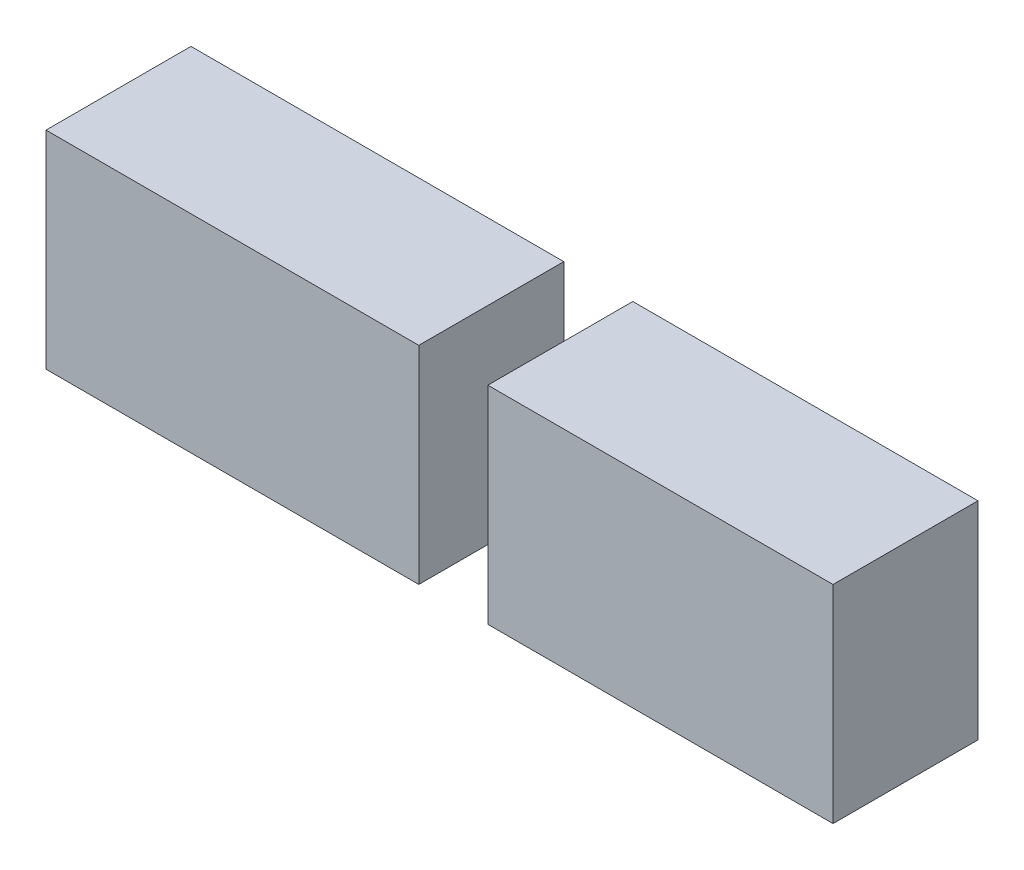
ISO-10303-21;
HEADER;
FILE_DESCRIPTION(('STEP AP214'),'2;1');
FILE_NAME('part.step','',(''),(''),'','','');
FILE_SCHEMA(('AUTOMOTIVE_DESIGN { 1 0 10303 214 1 1 1 1 }'));
ENDSEC;
DATA;
#1=APPLICATION_CONTEXT('core data for automotive mechanical design processes');
#2=APPLICATION_PROTOCOL_DEFINITION('international standard','automotive_design',2000,#1);
#3=PRODUCT_CONTEXT('',#1,'mechanical');
#4=PRODUCT('Part','Part','',(#3));
#5=PRODUCT_RELATED_PRODUCT_CATEGORY('part','',(#4));
#6=PRODUCT_DEFINITION_FORMATION('','',#4);
#7=PRODUCT_DEFINITION_CONTEXT('part definition',#1,'design');
#8=PRODUCT_DEFINITION('design','',#6,#7);
#9=PRODUCT_DEFINITION_SHAPE('','',#8);
#10=(LENGTH_UNIT() NAMED_UNIT(*) SI_UNIT(.MILLI.,.METRE.));
#11=(NAMED_UNIT(*) PLANE_ANGLE_UNIT() SI_UNIT($,.RADIAN.));
#12=(NAMED_UNIT(*) SI_UNIT($,.STERADIAN.) SOLID_ANGLE_UNIT());
#13=UNCERTAINTY_MEASURE_WITH_UNIT(LENGTH_MEASURE(1.E-05),#10,'distance_accuracy_value','');
#14=(GEOMETRIC_REPRESENTATION_CONTEXT(3) GLOBAL_UNCERTAINTY_ASSIGNED_CONTEXT((#13)) GLOBAL_UNIT_ASSIGNED_CONTEXT((#10,
#11,#12)) REPRESENTATION_CONTEXT('',''));
#15=CARTESIAN_POINT('',(0.,0.,0.));
#16=DIRECTION('',(0.,0.,1.));
#17=DIRECTION('',(1.,0.,0.));
#18=AXIS2_PLACEMENT_3D('',#15,#16,#17);
#19=CARTESIAN_POINT('',(-64.,30.,21.));
#20=DIRECTION('',(0.,0.,-1.));
#21=DIRECTION('',(0.,1.,0.));
#22=AXIS2_PLACEMENT_3D('',#19,#20,#21);
#23=PLANE('',#22);
#24=DIRECTION('',(0.,1.,0.));
#25=VECTOR('',#24,1.);
#26=CARTESIAN_POINT('',(-9.99999999999999,30.,21.));
#27=LINE('',#26,#25);
#28=CARTESIAN_POINT('',(-10.,0.,21.));
#29=VERTEX_POINT('',#28);
#30=CARTESIAN_POINT('',(-9.99999999999999,30.,21.));
#31=VERTEX_POINT('',#30);
#32=EDGE_CURVE('E109',#29,#31,#27,.T.);
#33=ORIENTED_EDGE('',*,*,#32,.T.);
#34=DIRECTION('',(1.,0.,0.));
#35=VECTOR('',#34,1.);
#36=CARTESIAN_POINT('',(-64.,30.,21.));
#37=LINE('',#36,#35);
#38=CARTESIAN_POINT('',(-64.,30.,21.));
#39=VERTEX_POINT('',#38);
#40=EDGE_CURVE('E12',#39,#31,#37,.T.);
#41=ORIENTED_EDGE('',*,*,#40,.F.);
#42=DIRECTION('',(0.,1.,0.));
#43=VECTOR('',#42,1.);
#44=CARTESIAN_POINT('',(-64.,30.,21.));
#45=LINE('',#44,#43);
#46=CARTESIAN_POINT('',(-64.,0.,21.));
#47=VERTEX_POINT('',#46);
#48=EDGE_CURVE('E97',#47,#39,#45,.T.);
#49=ORIENTED_EDGE('',*,*,#48,.F.);
#50=DIRECTION('',(1.,0.,0.));
#51=VECTOR('',#50,1.);
#52=CARTESIAN_POINT('',(-64.,0.,21.));
#53=LINE('',#52,#51);
#54=EDGE_CURVE('E105',#47,#29,#53,.T.);
#55=ORIENTED_EDGE('',*,*,#54,.T.);
#56=EDGE_LOOP('',(#33,#41,#49,#55));
#57=FACE_BOUND('',#56,.T.);
#58=ADVANCED_FACE('F46',(#57),#23,.F.);
#59=CARTESIAN_POINT('',(-64.,30.,21.));
#60=DIRECTION('',(0.,-1.,0.));
#61=DIRECTION('',(1.,0.,0.));
#62=AXIS2_PLACEMENT_3D('',#59,#60,#61);
#63=PLANE('',#62);
#64=DIRECTION('',(0.,0.,-1.));
#65=VECTOR('',#64,1.);
#66=CARTESIAN_POINT('',(-9.99999999999999,30.,21.));
#67=LINE('',#66,#65);
#68=CARTESIAN_POINT('',(-9.99999999999999,30.,0.));
#69=VERTEX_POINT('',#68);
#70=EDGE_CURVE('E101',#31,#69,#67,.T.);
#71=ORIENTED_EDGE('',*,*,#70,.T.);
#72=DIRECTION('',(1.,0.,0.));
#73=VECTOR('',#72,1.);
#74=CARTESIAN_POINT('',(-64.,30.,0.));
#75=LINE('',#74,#73);
#76=CARTESIAN_POINT('',(-64.,30.,0.));
#77=VERTEX_POINT('',#76);
#78=EDGE_CURVE('E54',#77,#69,#75,.T.);
#79=ORIENTED_EDGE('',*,*,#78,.F.);
#80=DIRECTION('',(0.,0.,-1.));
#81=VECTOR('',#80,1.);
#82=CARTESIAN_POINT('',(-64.,30.,21.));
#83=LINE('',#82,#81);
#84=EDGE_CURVE('E92',#39,#77,#83,.T.);
#85=ORIENTED_EDGE('',*,*,#84,.F.);
#86=ORIENTED_EDGE('',*,*,#40,.T.);
#87=EDGE_LOOP('',(#71,#79,#85,#86));
#88=FACE_BOUND('',#87,.T.);
#89=ADVANCED_FACE('F100',(#88),#63,.F.);
#90=CARTESIAN_POINT('',(-64.,30.,0.));
#91=DIRECTION('',(0.,0.,1.));
#92=DIRECTION('',(0.,-1.,0.));
#93=AXIS2_PLACEMENT_3D('',#90,#91,#92);
#94=PLANE('',#93);
#95=DIRECTION('',(0.,-1.,0.));
#96=VECTOR('',#95,1.);
#97=CARTESIAN_POINT('',(-9.99999999999999,30.,0.));
#98=LINE('',#97,#96);
#99=CARTESIAN_POINT('',(-10.,0.,0.));
#100=VERTEX_POINT('',#99);
#101=EDGE_CURVE('E79',#69,#100,#98,.T.);
#102=ORIENTED_EDGE('',*,*,#101,.T.);
#103=DIRECTION('',(1.,0.,0.));
#104=VECTOR('',#103,1.);
#105=CARTESIAN_POINT('',(-64.,0.,0.));
#106=LINE('',#105,#104);
#107=CARTESIAN_POINT('',(-64.,0.,0.));
#108=VERTEX_POINT('',#107);
#109=EDGE_CURVE('E102',#108,#100,#106,.T.);
#110=ORIENTED_EDGE('',*,*,#109,.F.);
#111=DIRECTION('',(0.,-1.,0.));
#112=VECTOR('',#111,1.);
#113=CARTESIAN_POINT('',(-64.,30.,0.));
#114=LINE('',#113,#112);
#115=EDGE_CURVE('E95',#77,#108,#114,.T.);
#116=ORIENTED_EDGE('',*,*,#115,.F.);
#117=ORIENTED_EDGE('',*,*,#78,.T.);
#118=EDGE_LOOP('',(#102,#110,#116,#117));
#119=FACE_BOUND('',#118,.T.);
#120=ADVANCED_FACE('F103',(#119),#94,.F.);
#121=CARTESIAN_POINT('',(-64.,0.,21.));
#122=DIRECTION('',(0.,1.,0.));
#123=DIRECTION('',(-1.,0.,0.));
#124=AXIS2_PLACEMENT_3D('',#121,#122,#123);
#125=PLANE('',#124);
#126=DIRECTION('',(0.,0.,1.));
#127=VECTOR('',#126,1.);
#128=CARTESIAN_POINT('',(-10.,0.,21.));
#129=LINE('',#128,#127);
#130=EDGE_CURVE('E85',#100,#29,#129,.T.);
#131=ORIENTED_EDGE('',*,*,#130,.T.);
#132=ORIENTED_EDGE('',*,*,#54,.F.);
#133=DIRECTION('',(0.,0.,1.));
#134=VECTOR('',#133,1.);
#135=CARTESIAN_POINT('',(-64.,0.,21.));
#136=LINE('',#135,#134);
#137=EDGE_CURVE('E62',#108,#47,#136,.T.);
#138=ORIENTED_EDGE('',*,*,#137,.F.);
#139=ORIENTED_EDGE('',*,*,#109,.T.);
#140=EDGE_LOOP('',(#131,#132,#138,#139));
#141=FACE_BOUND('',#140,.T.);
#142=ADVANCED_FACE('F116',(#141),#125,.F.);
#143=CARTESIAN_POINT('',(-64.,0.,0.));
#144=DIRECTION('',(1.,0.,0.));
#145=DIRECTION('',(0.,1.,0.));
#146=AXIS2_PLACEMENT_3D('',#143,#144,#145);
#147=PLANE('',#146);
#148=ORIENTED_EDGE('',*,*,#48,.T.);
#149=ORIENTED_EDGE('',*,*,#84,.T.);
#150=ORIENTED_EDGE('',*,*,#115,.T.);
#151=ORIENTED_EDGE('',*,*,#137,.T.);
#152=EDGE_LOOP('',(#148,#149,#150,#151));
#153=FACE_BOUND('',#152,.T.);
#154=ADVANCED_FACE('F93',(#153),#147,.F.);
#155=CARTESIAN_POINT('',(-10.,0.,0.));
#156=DIRECTION('',(1.,0.,0.));
#157=DIRECTION('',(0.,1.,0.));
#158=AXIS2_PLACEMENT_3D('',#155,#156,#157);
#159=PLANE('',#158);
#160=ORIENTED_EDGE('',*,*,#32,.F.);
#161=ORIENTED_EDGE('',*,*,#130,.F.);
#162=ORIENTED_EDGE('',*,*,#101,.F.);
#163=ORIENTED_EDGE('',*,*,#70,.F.);
#164=EDGE_LOOP('',(#160,#161,#162,#163));
#165=FACE_BOUND('',#164,.T.);
#166=ADVANCED_FACE('F119',(#165),#159,.T.);
#167=CLOSED_SHELL('',(#58,#89,#120,#142,#154,#166));
#168=MANIFOLD_SOLID_BREP('B2',#167);
#169=CARTESIAN_POINT('',(0.,0.,21.));
#170=DIRECTION('',(1.,0.,0.));
#171=DIRECTION('',(0.,1.,0.));
#172=AXIS2_PLACEMENT_3D('',#169,#170,#171);
#173=PLANE('',#172);
#174=DIRECTION('',(0.,-1.,0.));
#175=VECTOR('',#174,1.);
#176=CARTESIAN_POINT('',(0.,0.,0.));
#177=LINE('',#176,#175);
#178=CARTESIAN_POINT('',(0.,30.,0.));
#179=VERTEX_POINT('',#178);
#180=CARTESIAN_POINT('',(0.,0.,0.));
#181=VERTEX_POINT('',#180);
#182=EDGE_CURVE('E232',#179,#181,#177,.T.);
#183=ORIENTED_EDGE('',*,*,#182,.T.);
#184=DIRECTION('',(0.,0.,-1.));
#185=VECTOR('',#184,1.);
#186=CARTESIAN_POINT('',(0.,0.,21.));
#187=LINE('',#186,#185);
#188=CARTESIAN_POINT('',(0.,0.,21.));
#189=VERTEX_POINT('',#188);
#190=EDGE_CURVE('E44',#189,#181,#187,.T.);
#191=ORIENTED_EDGE('',*,*,#190,.F.);
#192=DIRECTION('',(0.,-1.,0.));
#193=VECTOR('',#192,1.);
#194=CARTESIAN_POINT('',(0.,0.,21.));
#195=LINE('',#194,#193);
#196=CARTESIAN_POINT('',(0.,30.,21.));
#197=VERTEX_POINT('',#196);
#198=EDGE_CURVE('E220',#197,#189,#195,.T.);
#199=ORIENTED_EDGE('',*,*,#198,.F.);
#200=DIRECTION('',(0.,0.,-1.));
#201=VECTOR('',#200,1.);
#202=CARTESIAN_POINT('',(0.,30.,21.));
#203=LINE('',#202,#201);
#204=EDGE_CURVE('E228',#197,#179,#203,.T.);
#205=ORIENTED_EDGE('',*,*,#204,.T.);
#206=EDGE_LOOP('',(#183,#191,#199,#205));
#207=FACE_BOUND('',#206,.T.);
#208=ADVANCED_FACE('F169',(#207),#173,.F.);
#209=CARTESIAN_POINT('',(0.,0.,21.));
#210=DIRECTION('',(0.,1.,0.));
#211=DIRECTION('',(0.,0.,1.));
#212=AXIS2_PLACEMENT_3D('',#209,#210,#211);
#213=PLANE('',#212);
#214=DIRECTION('',(1.,0.,0.));
#215=VECTOR('',#214,1.);
#216=CARTESIAN_POINT('',(0.,0.,0.));
#217=LINE('',#216,#215);
#218=CARTESIAN_POINT('',(50.,0.,0.));
#219=VERTEX_POINT('',#218);
#220=EDGE_CURVE('E224',#181,#219,#217,.T.);
#221=ORIENTED_EDGE('',*,*,#220,.T.);
#222=DIRECTION('',(0.,0.,-1.));
#223=VECTOR('',#222,1.);
#224=CARTESIAN_POINT('',(50.,0.,21.));
#225=LINE('',#224,#223);
#226=CARTESIAN_POINT('',(50.,0.,21.));
#227=VERTEX_POINT('',#226);
#228=EDGE_CURVE('E177',#227,#219,#225,.T.);
#229=ORIENTED_EDGE('',*,*,#228,.F.);
#230=DIRECTION('',(1.,0.,0.));
#231=VECTOR('',#230,1.);
#232=CARTESIAN_POINT('',(0.,0.,21.));
#233=LINE('',#232,#231);
#234=EDGE_CURVE('E215',#189,#227,#233,.T.);
#235=ORIENTED_EDGE('',*,*,#234,.F.);
#236=ORIENTED_EDGE('',*,*,#190,.T.);
#237=EDGE_LOOP('',(#221,#229,#235,#236));
#238=FACE_BOUND('',#237,.T.);
#239=ADVANCED_FACE('F223',(#238),#213,.F.);
#240=CARTESIAN_POINT('',(50.,0.,21.));
#241=DIRECTION('',(-1.,0.,0.));
#242=DIRECTION('',(0.,0.,1.));
#243=AXIS2_PLACEMENT_3D('',#240,#241,#242);
#244=PLANE('',#243);
#245=DIRECTION('',(0.,1.,0.));
#246=VECTOR('',#245,1.);
#247=CARTESIAN_POINT('',(50.,0.,0.));
#248=LINE('',#247,#246);
#249=CARTESIAN_POINT('',(50.,30.,0.));
#250=VERTEX_POINT('',#249);
#251=EDGE_CURVE('E202',#219,#250,#248,.T.);
#252=ORIENTED_EDGE('',*,*,#251,.T.);
#253=DIRECTION('',(0.,0.,-1.));
#254=VECTOR('',#253,1.);
#255=CARTESIAN_POINT('',(50.,30.,21.));
#256=LINE('',#255,#254);
#257=CARTESIAN_POINT('',(50.,30.,21.));
#258=VERTEX_POINT('',#257);
#259=EDGE_CURVE('E225',#258,#250,#256,.T.);
#260=ORIENTED_EDGE('',*,*,#259,.F.);
#261=DIRECTION('',(0.,1.,0.));
#262=VECTOR('',#261,1.);
#263=CARTESIAN_POINT('',(50.,0.,21.));
#264=LINE('',#263,#262);
#265=EDGE_CURVE('E218',#227,#258,#264,.T.);
#266=ORIENTED_EDGE('',*,*,#265,.F.);
#267=ORIENTED_EDGE('',*,*,#228,.T.);
#268=EDGE_LOOP('',(#252,#260,#266,#267));
#269=FACE_BOUND('',#268,.T.);
#270=ADVANCED_FACE('F226',(#269),#244,.F.);
#271=CARTESIAN_POINT('',(0.,30.,21.));
#272=DIRECTION('',(0.,-1.,0.));
#273=DIRECTION('',(0.,0.,-1.));
#274=AXIS2_PLACEMENT_3D('',#271,#272,#273);
#275=PLANE('',#274);
#276=DIRECTION('',(-1.,0.,0.));
#277=VECTOR('',#276,1.);
#278=CARTESIAN_POINT('',(0.,30.,0.));
#279=LINE('',#278,#277);
#280=EDGE_CURVE('E208',#250,#179,#279,.T.);
#281=ORIENTED_EDGE('',*,*,#280,.T.);
#282=ORIENTED_EDGE('',*,*,#204,.F.);
#283=DIRECTION('',(-1.,0.,0.));
#284=VECTOR('',#283,1.);
#285=CARTESIAN_POINT('',(0.,30.,21.));
#286=LINE('',#285,#284);
#287=EDGE_CURVE('E185',#258,#197,#286,.T.);
#288=ORIENTED_EDGE('',*,*,#287,.F.);
#289=ORIENTED_EDGE('',*,*,#259,.T.);
#290=EDGE_LOOP('',(#281,#282,#288,#289));
#291=FACE_BOUND('',#290,.T.);
#292=ADVANCED_FACE('F239',(#291),#275,.F.);
#293=CARTESIAN_POINT('',(0.,0.,21.));
#294=DIRECTION('',(0.,0.,-1.));
#295=DIRECTION('',(-1.,0.,0.));
#296=AXIS2_PLACEMENT_3D('',#293,#294,#295);
#297=PLANE('',#296);
#298=ORIENTED_EDGE('',*,*,#198,.T.);
#299=ORIENTED_EDGE('',*,*,#234,.T.);
#300=ORIENTED_EDGE('',*,*,#265,.T.);
#301=ORIENTED_EDGE('',*,*,#287,.T.);
#302=EDGE_LOOP('',(#298,#299,#300,#301));
#303=FACE_BOUND('',#302,.T.);
#304=ADVANCED_FACE('F216',(#303),#297,.F.);
#305=CARTESIAN_POINT('',(0.,0.,0.));
#306=DIRECTION('',(0.,0.,-1.));
#307=DIRECTION('',(-1.,0.,0.));
#308=AXIS2_PLACEMENT_3D('',#305,#306,#307);
#309=PLANE('',#308);
#310=ORIENTED_EDGE('',*,*,#182,.F.);
#311=ORIENTED_EDGE('',*,*,#280,.F.);
#312=ORIENTED_EDGE('',*,*,#251,.F.);
#313=ORIENTED_EDGE('',*,*,#220,.F.);
#314=EDGE_LOOP('',(#310,#311,#312,#313));
#315=FACE_BOUND('',#314,.T.);
#316=ADVANCED_FACE('F242',(#315),#309,.T.);
#317=CLOSED_SHELL('',(#208,#239,#270,#292,#304,#316));
#318=MANIFOLD_SOLID_BREP('B6',#317);
#319=ADVANCED_BREP_SHAPE_REPRESENTATION('',(#18,#168,#318),#14);
#320=SHAPE_DEFINITION_REPRESENTATION(#9,#319);
ENDSEC;
END-ISO-10303-21;
